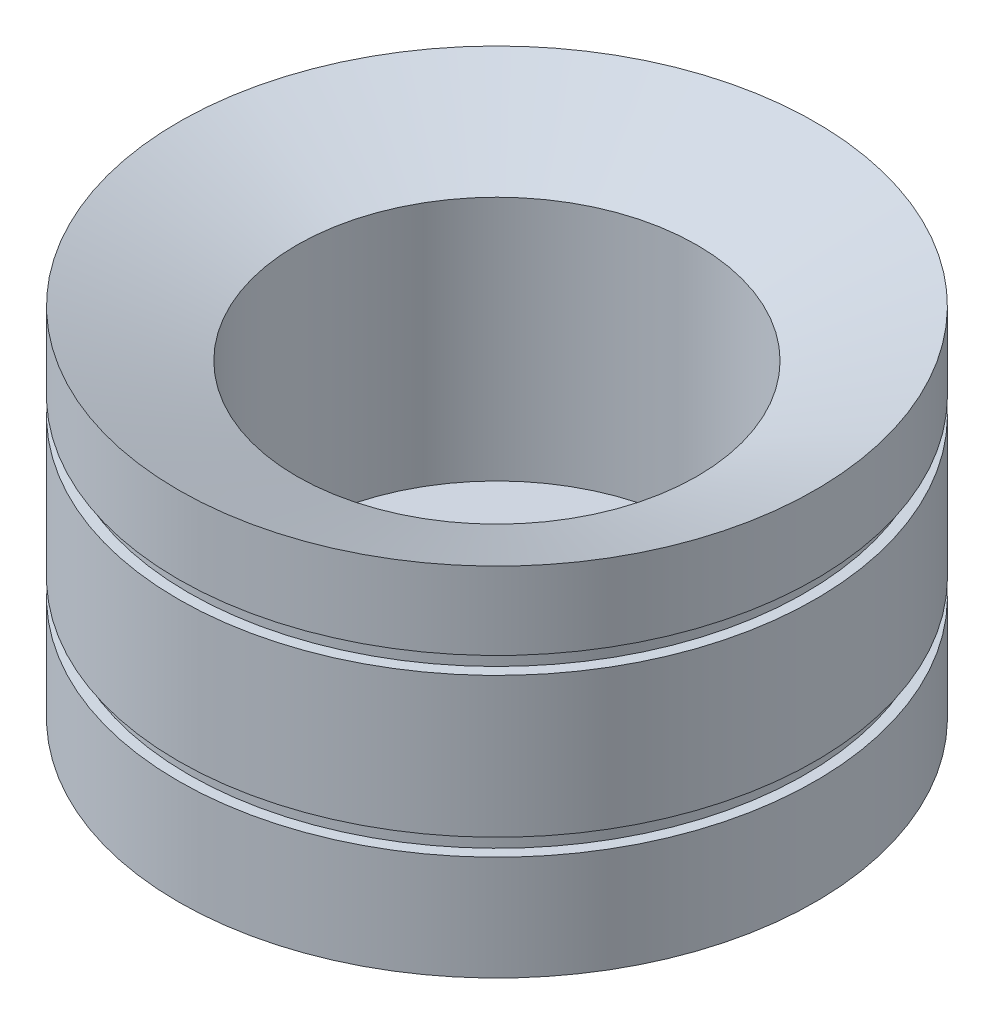
ISO-10303-21;
HEADER;
FILE_DESCRIPTION(('STEP AP214'),'2;1');
FILE_NAME('part.step','',(''),(''),'','','');
FILE_SCHEMA(('AUTOMOTIVE_DESIGN { 1 0 10303 214 1 1 1 1 }'));
ENDSEC;
DATA;
#1=APPLICATION_CONTEXT('core data for automotive mechanical design processes');
#2=APPLICATION_PROTOCOL_DEFINITION('international standard','automotive_design',2000,#1);
#3=PRODUCT_CONTEXT('',#1,'mechanical');
#4=PRODUCT('Part','Part','',(#3));
#5=PRODUCT_RELATED_PRODUCT_CATEGORY('part','',(#4));
#6=PRODUCT_DEFINITION_FORMATION('','',#4);
#7=PRODUCT_DEFINITION_CONTEXT('part definition',#1,'design');
#8=PRODUCT_DEFINITION('design','',#6,#7);
#9=PRODUCT_DEFINITION_SHAPE('','',#8);
#10=(LENGTH_UNIT() NAMED_UNIT(*) SI_UNIT(.MILLI.,.METRE.));
#11=(NAMED_UNIT(*) PLANE_ANGLE_UNIT() SI_UNIT($,.RADIAN.));
#12=(NAMED_UNIT(*) SI_UNIT($,.STERADIAN.) SOLID_ANGLE_UNIT());
#13=UNCERTAINTY_MEASURE_WITH_UNIT(LENGTH_MEASURE(1.E-05),#10,'distance_accuracy_value','');
#14=(GEOMETRIC_REPRESENTATION_CONTEXT(3) GLOBAL_UNCERTAINTY_ASSIGNED_CONTEXT((#13)) GLOBAL_UNIT_ASSIGNED_CONTEXT((#10,
#11,#12)) REPRESENTATION_CONTEXT('',''));
#15=CARTESIAN_POINT('',(0.,0.,0.));
#16=DIRECTION('',(0.,0.,1.));
#17=DIRECTION('',(1.,0.,0.));
#18=AXIS2_PLACEMENT_3D('',#15,#16,#17);
#19=CARTESIAN_POINT('',(0.,-48.6619700898636,0.));
#20=DIRECTION('',(0.,-1.,0.));
#21=DIRECTION('',(0.,0.,-1.));
#22=AXIS2_PLACEMENT_3D('',#19,#20,#21);
#23=PLANE('',#22);
#24=CARTESIAN_POINT('',(0.,-48.6619700898636,0.));
#25=DIRECTION('',(0.,1.,0.));
#26=DIRECTION('',(0.,0.,1.));
#27=AXIS2_PLACEMENT_3D('',#24,#25,#26);
#28=CIRCLE('',#27,70.);
#29=CARTESIAN_POINT('',(0.,-48.6619700898636,70.));
#30=VERTEX_POINT('',#29);
#31=EDGE_CURVE('E10',#30,#30,#28,.T.);
#32=ORIENTED_EDGE('',*,*,#31,.F.);
#33=EDGE_LOOP('',(#32));
#34=FACE_BOUND('',#33,.T.);
#35=ADVANCED_FACE('F40',(#34),#23,.T.);
#36=CARTESIAN_POINT('',(0.,54.3448055471995,0.));
#37=DIRECTION('',(0.,1.,0.));
#38=DIRECTION('',(0.,0.,1.));
#39=AXIS2_PLACEMENT_3D('',#36,#37,#38);
#40=CYLINDRICAL_SURFACE('',#39,70.);
#41=ORIENTED_EDGE('',*,*,#31,.T.);
#42=EDGE_LOOP('',(#41));
#43=FACE_BOUND('',#42,.T.);
#44=CARTESIAN_POINT('',(0.,-25.6619700898636,0.));
#45=DIRECTION('',(0.,1.,0.));
#46=DIRECTION('',(0.,0.,1.));
#47=AXIS2_PLACEMENT_3D('',#44,#45,#46);
#48=CIRCLE('',#47,70.);
#49=CARTESIAN_POINT('',(0.,-25.6619700898636,70.));
#50=VERTEX_POINT('',#49);
#51=EDGE_CURVE('E43',#50,#50,#48,.T.);
#52=ORIENTED_EDGE('',*,*,#51,.F.);
#53=EDGE_LOOP('',(#52));
#54=FACE_BOUND('',#53,.T.);
#55=ADVANCED_FACE('F100',(#43,#54),#40,.T.);
#56=CARTESIAN_POINT('',(0.,-25.5445766642696,0.));
#57=DIRECTION('',(0.,-1.,0.));
#58=DIRECTION('',(0.,0.,-1.));
#59=AXIS2_PLACEMENT_3D('',#56,#57,#58);
#60=CONICAL_SURFACE('',#59,67.76,1.51843644923507);
#61=ORIENTED_EDGE('',*,*,#51,.T.);
#62=EDGE_LOOP('',(#61));
#63=FACE_BOUND('',#62,.T.);
#64=CARTESIAN_POINT('',(0.,-25.5445766642696,0.));
#65=DIRECTION('',(0.,1.,0.));
#66=DIRECTION('',(0.,0.,1.));
#67=AXIS2_PLACEMENT_3D('',#64,#65,#66);
#68=CIRCLE('',#67,67.76);
#69=CARTESIAN_POINT('',(0.,-25.5445766642696,67.76));
#70=VERTEX_POINT('',#69);
#71=EDGE_CURVE('E50',#70,#70,#68,.T.);
#72=ORIENTED_EDGE('',*,*,#71,.F.);
#73=EDGE_LOOP('',(#72));
#74=FACE_BOUND('',#73,.T.);
#75=ADVANCED_FACE('F105',(#63,#74),#60,.T.);
#76=CARTESIAN_POINT('',(0.,54.3448055471995,0.));
#77=DIRECTION('',(0.,1.,0.));
#78=DIRECTION('',(0.,0.,1.));
#79=AXIS2_PLACEMENT_3D('',#76,#77,#78);
#80=CYLINDRICAL_SURFACE('',#79,67.76);
#81=ORIENTED_EDGE('',*,*,#71,.T.);
#82=EDGE_LOOP('',(#81));
#83=FACE_BOUND('',#82,.T.);
#84=CARTESIAN_POINT('',(0.,-21.9845766642696,0.));
#85=DIRECTION('',(0.,1.,0.));
#86=DIRECTION('',(0.,0.,1.));
#87=AXIS2_PLACEMENT_3D('',#84,#85,#86);
#88=CIRCLE('',#87,67.76);
#89=CARTESIAN_POINT('',(0.,-21.9845766642696,67.76));
#90=VERTEX_POINT('',#89);
#91=EDGE_CURVE('E51',#90,#90,#88,.T.);
#92=ORIENTED_EDGE('',*,*,#91,.F.);
#93=EDGE_LOOP('',(#92));
#94=FACE_BOUND('',#93,.T.);
#95=ADVANCED_FACE('F106',(#83,#94),#80,.T.);
#96=CARTESIAN_POINT('',(0.,-21.8671832386756,0.));
#97=DIRECTION('',(0.,1.,0.));
#98=DIRECTION('',(0.,0.,1.));
#99=AXIS2_PLACEMENT_3D('',#96,#97,#98);
#100=CONICAL_SURFACE('',#99,70.,1.51843644923507);
#101=ORIENTED_EDGE('',*,*,#91,.T.);
#102=EDGE_LOOP('',(#101));
#103=FACE_BOUND('',#102,.T.);
#104=CARTESIAN_POINT('',(0.,-21.8671832386756,0.));
#105=DIRECTION('',(0.,1.,0.));
#106=DIRECTION('',(0.,0.,1.));
#107=AXIS2_PLACEMENT_3D('',#104,#105,#106);
#108=CIRCLE('',#107,70.);
#109=CARTESIAN_POINT('',(0.,-21.8671832386756,70.));
#110=VERTEX_POINT('',#109);
#111=EDGE_CURVE('E57',#110,#110,#108,.T.);
#112=ORIENTED_EDGE('',*,*,#111,.F.);
#113=EDGE_LOOP('',(#112));
#114=FACE_BOUND('',#113,.T.);
#115=ADVANCED_FACE('F115',(#103,#114),#100,.T.);
#116=CARTESIAN_POINT('',(0.,54.3448055471995,0.));
#117=DIRECTION('',(0.,1.,0.));
#118=DIRECTION('',(0.,0.,1.));
#119=AXIS2_PLACEMENT_3D('',#116,#117,#118);
#120=CYLINDRICAL_SURFACE('',#119,70.);
#121=ORIENTED_EDGE('',*,*,#111,.T.);
#122=EDGE_LOOP('',(#121));
#123=FACE_BOUND('',#122,.T.);
#124=CARTESIAN_POINT('',(0.,8.93586967158128,0.));
#125=DIRECTION('',(0.,1.,0.));
#126=DIRECTION('',(0.,0.,1.));
#127=AXIS2_PLACEMENT_3D('',#124,#125,#126);
#128=CIRCLE('',#127,70.);
#129=CARTESIAN_POINT('',(0.,8.93586967158128,70.));
#130=VERTEX_POINT('',#129);
#131=EDGE_CURVE('E56',#130,#130,#128,.T.);
#132=ORIENTED_EDGE('',*,*,#131,.F.);
#133=EDGE_LOOP('',(#132));
#134=FACE_BOUND('',#133,.T.);
#135=ADVANCED_FACE('F117',(#123,#134),#120,.T.);
#136=CARTESIAN_POINT('',(0.,9.05310221356547,0.));
#137=DIRECTION('',(0.,-1.,0.));
#138=DIRECTION('',(0.,0.,-1.));
#139=AXIS2_PLACEMENT_3D('',#136,#137,#138);
#140=CONICAL_SURFACE('',#139,67.7630698421497,1.51843644923507);
#141=ORIENTED_EDGE('',*,*,#131,.T.);
#142=EDGE_LOOP('',(#141));
#143=FACE_BOUND('',#142,.T.);
#144=CARTESIAN_POINT('',(0.,9.05310221356547,0.));
#145=DIRECTION('',(0.,1.,0.));
#146=DIRECTION('',(0.,0.,1.));
#147=AXIS2_PLACEMENT_3D('',#144,#145,#146);
#148=CIRCLE('',#147,67.7630698421497);
#149=CARTESIAN_POINT('',(0.,9.05310221356547,67.7630698421497));
#150=VERTEX_POINT('',#149);
#151=EDGE_CURVE('E65',#150,#150,#148,.T.);
#152=ORIENTED_EDGE('',*,*,#151,.F.);
#153=EDGE_LOOP('',(#152));
#154=FACE_BOUND('',#153,.T.);
#155=ADVANCED_FACE('F118',(#143,#154),#140,.T.);
#156=CARTESIAN_POINT('',(0.,54.3448055471995,0.));
#157=DIRECTION('',(0.,1.,0.));
#158=DIRECTION('',(0.,0.,1.));
#159=AXIS2_PLACEMENT_3D('',#156,#157,#158);
#160=CYLINDRICAL_SURFACE('',#159,67.7630698421497);
#161=ORIENTED_EDGE('',*,*,#151,.T.);
#162=EDGE_LOOP('',(#161));
#163=FACE_BOUND('',#162,.T.);
#164=CARTESIAN_POINT('',(0.,12.6131022135655,0.));
#165=DIRECTION('',(0.,1.,0.));
#166=DIRECTION('',(0.,0.,1.));
#167=AXIS2_PLACEMENT_3D('',#164,#165,#166);
#168=CIRCLE('',#167,67.7630698421497);
#169=CARTESIAN_POINT('',(0.,12.6131022135655,67.7630698421497));
#170=VERTEX_POINT('',#169);
#171=EDGE_CURVE('E63',#170,#170,#168,.T.);
#172=ORIENTED_EDGE('',*,*,#171,.F.);
#173=EDGE_LOOP('',(#172));
#174=FACE_BOUND('',#173,.T.);
#175=ADVANCED_FACE('F121',(#163,#174),#160,.T.);
#176=CARTESIAN_POINT('',(0.,12.7303347555497,0.));
#177=DIRECTION('',(0.,1.,0.));
#178=DIRECTION('',(0.,0.,1.));
#179=AXIS2_PLACEMENT_3D('',#176,#177,#178);
#180=CONICAL_SURFACE('',#179,70.,1.51843644923507);
#181=ORIENTED_EDGE('',*,*,#171,.T.);
#182=EDGE_LOOP('',(#181));
#183=FACE_BOUND('',#182,.T.);
#184=CARTESIAN_POINT('',(0.,12.7303347555497,0.));
#185=DIRECTION('',(0.,1.,0.));
#186=DIRECTION('',(0.,0.,1.));
#187=AXIS2_PLACEMENT_3D('',#184,#185,#186);
#188=CIRCLE('',#187,70.);
#189=CARTESIAN_POINT('',(0.,12.7303347555497,70.));
#190=VERTEX_POINT('',#189);
#191=EDGE_CURVE('E69',#190,#190,#188,.T.);
#192=ORIENTED_EDGE('',*,*,#191,.F.);
#193=EDGE_LOOP('',(#192));
#194=FACE_BOUND('',#193,.T.);
#195=ADVANCED_FACE('F126',(#183,#194),#180,.T.);
#196=CARTESIAN_POINT('',(0.,54.3448055471995,0.));
#197=DIRECTION('',(0.,1.,0.));
#198=DIRECTION('',(0.,0.,1.));
#199=AXIS2_PLACEMENT_3D('',#196,#197,#198);
#200=CYLINDRICAL_SURFACE('',#199,70.);
#201=ORIENTED_EDGE('',*,*,#191,.T.);
#202=EDGE_LOOP('',(#201));
#203=FACE_BOUND('',#202,.T.);
#204=CARTESIAN_POINT('',(0.,29.7303347555497,0.));
#205=DIRECTION('',(0.,1.,0.));
#206=DIRECTION('',(0.,0.,1.));
#207=AXIS2_PLACEMENT_3D('',#204,#205,#206);
#208=CIRCLE('',#207,70.);
#209=CARTESIAN_POINT('',(0.,29.7303347555497,70.));
#210=VERTEX_POINT('',#209);
#211=EDGE_CURVE('E72',#210,#210,#208,.T.);
#212=ORIENTED_EDGE('',*,*,#211,.F.);
#213=EDGE_LOOP('',(#212));
#214=FACE_BOUND('',#213,.T.);
#215=ADVANCED_FACE('F91',(#203,#214),#200,.T.);
#216=CARTESIAN_POINT('',(0.,19.3380299101364,0.));
#217=DIRECTION('',(0.,1.,0.));
#218=DIRECTION('',(0.,0.,1.));
#219=AXIS2_PLACEMENT_3D('',#216,#217,#218);
#220=CONICAL_SURFACE('',#219,44.,1.19054512010196);
#221=ORIENTED_EDGE('',*,*,#211,.T.);
#222=EDGE_LOOP('',(#221));
#223=FACE_BOUND('',#222,.T.);
#224=CARTESIAN_POINT('',(0.,19.3380299101364,0.));
#225=DIRECTION('',(0.,1.,0.));
#226=DIRECTION('',(0.,0.,1.));
#227=AXIS2_PLACEMENT_3D('',#224,#225,#226);
#228=CIRCLE('',#227,44.);
#229=CARTESIAN_POINT('',(0.,19.3380299101364,44.));
#230=VERTEX_POINT('',#229);
#231=EDGE_CURVE('E74',#230,#230,#228,.T.);
#232=ORIENTED_EDGE('',*,*,#231,.F.);
#233=EDGE_LOOP('',(#232));
#234=FACE_BOUND('',#233,.T.);
#235=ADVANCED_FACE('F83',(#223,#234),#220,.F.);
#236=CARTESIAN_POINT('',(0.,54.3448055471995,0.));
#237=DIRECTION('',(0.,1.,0.));
#238=DIRECTION('',(0.,0.,1.));
#239=AXIS2_PLACEMENT_3D('',#236,#237,#238);
#240=CYLINDRICAL_SURFACE('',#239,44.);
#241=ORIENTED_EDGE('',*,*,#231,.T.);
#242=EDGE_LOOP('',(#241));
#243=FACE_BOUND('',#242,.T.);
#244=CARTESIAN_POINT('',(0.,-34.6619700898636,0.));
#245=DIRECTION('',(0.,1.,0.));
#246=DIRECTION('',(0.,0.,1.));
#247=AXIS2_PLACEMENT_3D('',#244,#245,#246);
#248=CIRCLE('',#247,44.);
#249=CARTESIAN_POINT('',(0.,-34.6619700898636,44.));
#250=VERTEX_POINT('',#249);
#251=EDGE_CURVE('E80',#250,#250,#248,.T.);
#252=ORIENTED_EDGE('',*,*,#251,.F.);
#253=EDGE_LOOP('',(#252));
#254=FACE_BOUND('',#253,.T.);
#255=ADVANCED_FACE('F84',(#243,#254),#240,.F.);
#256=CARTESIAN_POINT('',(-44.,-34.6619700898636,0.));
#257=DIRECTION('',(0.,1.,0.));
#258=DIRECTION('',(0.,0.,1.));
#259=AXIS2_PLACEMENT_3D('',#256,#257,#258);
#260=PLANE('',#259);
#261=ORIENTED_EDGE('',*,*,#251,.T.);
#262=EDGE_LOOP('',(#261));
#263=FACE_BOUND('',#262,.T.);
#264=ADVANCED_FACE('F82',(#263),#260,.T.);
#265=CLOSED_SHELL('',(#35,#55,#75,#95,#115,#135,#155,#175,#195,#215,#235,#255,#264));
#266=MANIFOLD_SOLID_BREP('B2',#265);
#267=ADVANCED_BREP_SHAPE_REPRESENTATION('',(#18,#266),#14);
#268=SHAPE_DEFINITION_REPRESENTATION(#9,#267);
ENDSEC;
END-ISO-10303-21;
